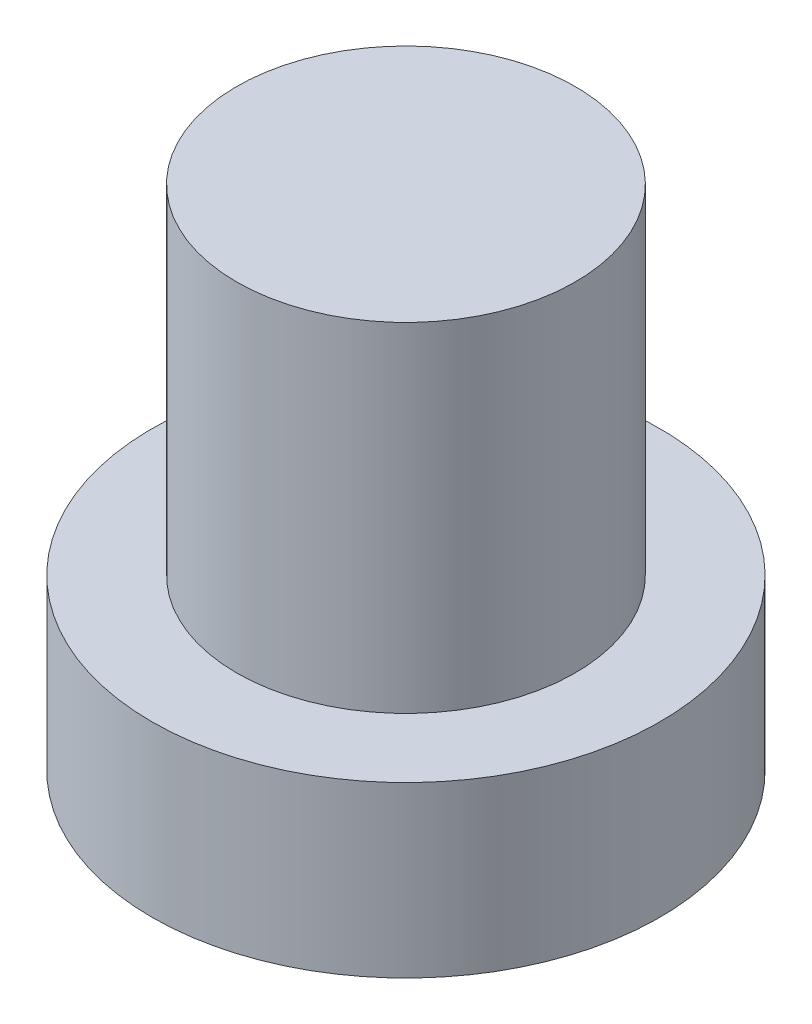
ISO-10303-21;
HEADER;
FILE_DESCRIPTION(('STEP AP214'),'2;1');
FILE_NAME('part.step','',(''),(''),'','','');
FILE_SCHEMA(('AUTOMOTIVE_DESIGN { 1 0 10303 214 1 1 1 1 }'));
ENDSEC;
DATA;
#1=APPLICATION_CONTEXT('core data for automotive mechanical design processes');
#2=APPLICATION_PROTOCOL_DEFINITION('international standard','automotive_design',2000,#1);
#3=PRODUCT_CONTEXT('',#1,'mechanical');
#4=PRODUCT('Part','Part','',(#3));
#5=PRODUCT_RELATED_PRODUCT_CATEGORY('part','',(#4));
#6=PRODUCT_DEFINITION_FORMATION('','',#4);
#7=PRODUCT_DEFINITION_CONTEXT('part definition',#1,'design');
#8=PRODUCT_DEFINITION('design','',#6,#7);
#9=PRODUCT_DEFINITION_SHAPE('','',#8);
#10=(LENGTH_UNIT() NAMED_UNIT(*) SI_UNIT(.MILLI.,.METRE.));
#11=(NAMED_UNIT(*) PLANE_ANGLE_UNIT() SI_UNIT($,.RADIAN.));
#12=(NAMED_UNIT(*) SI_UNIT($,.STERADIAN.) SOLID_ANGLE_UNIT());
#13=UNCERTAINTY_MEASURE_WITH_UNIT(LENGTH_MEASURE(1.E-05),#10,'distance_accuracy_value','');
#14=(GEOMETRIC_REPRESENTATION_CONTEXT(3) GLOBAL_UNCERTAINTY_ASSIGNED_CONTEXT((#13)) GLOBAL_UNIT_ASSIGNED_CONTEXT((#10,
#11,#12)) REPRESENTATION_CONTEXT('',''));
#15=CARTESIAN_POINT('',(0.,0.,0.));
#16=DIRECTION('',(0.,0.,1.));
#17=DIRECTION('',(1.,0.,0.));
#18=AXIS2_PLACEMENT_3D('',#15,#16,#17);
#19=CARTESIAN_POINT('',(0.,5.,0.));
#20=DIRECTION('',(0.,-1.,0.));
#21=DIRECTION('',(0.,0.,-1.));
#22=AXIS2_PLACEMENT_3D('',#19,#20,#21);
#23=CYLINDRICAL_SURFACE('',#22,7.5);
#24=CARTESIAN_POINT('',(0.,5.,0.));
#25=DIRECTION('',(0.,1.,0.));
#26=DIRECTION('',(0.,0.,1.));
#27=AXIS2_PLACEMENT_3D('',#24,#25,#26);
#28=CIRCLE('',#27,7.5);
#29=CARTESIAN_POINT('',(0.,5.,7.5));
#30=VERTEX_POINT('',#29);
#31=EDGE_CURVE('E49',#30,#30,#28,.T.);
#32=ORIENTED_EDGE('',*,*,#31,.F.);
#33=EDGE_LOOP('',(#32));
#34=FACE_BOUND('',#33,.T.);
#35=CARTESIAN_POINT('',(0.,0.,0.));
#36=DIRECTION('',(0.,1.,0.));
#37=DIRECTION('',(0.,0.,1.));
#38=AXIS2_PLACEMENT_3D('',#35,#36,#37);
#39=CIRCLE('',#38,7.5);
#40=CARTESIAN_POINT('',(0.,0.,7.5));
#41=VERTEX_POINT('',#40);
#42=EDGE_CURVE('E44',#41,#41,#39,.T.);
#43=ORIENTED_EDGE('',*,*,#42,.T.);
#44=EDGE_LOOP('',(#43));
#45=FACE_BOUND('',#44,.T.);
#46=ADVANCED_FACE('F41',(#34,#45),#23,.T.);
#47=CARTESIAN_POINT('',(0.,5.,0.));
#48=DIRECTION('',(0.,1.,0.));
#49=DIRECTION('',(0.,0.,1.));
#50=AXIS2_PLACEMENT_3D('',#47,#48,#49);
#51=PLANE('',#50);
#52=CARTESIAN_POINT('',(0.,5.,0.));
#53=DIRECTION('',(0.,1.,0.));
#54=DIRECTION('',(0.,0.,1.));
#55=AXIS2_PLACEMENT_3D('',#52,#53,#54);
#56=CIRCLE('',#55,5.);
#57=CARTESIAN_POINT('',(0.,5.,5.));
#58=VERTEX_POINT('',#57);
#59=EDGE_CURVE('E11',#58,#58,#56,.T.);
#60=ORIENTED_EDGE('',*,*,#59,.F.);
#61=EDGE_LOOP('',(#60));
#62=FACE_BOUND('',#61,.T.);
#63=ORIENTED_EDGE('',*,*,#31,.T.);
#64=EDGE_LOOP('',(#63));
#65=FACE_BOUND('',#64,.T.);
#66=ADVANCED_FACE('F132',(#62,#65),#51,.T.);
#67=CARTESIAN_POINT('',(0.,0.,0.));
#68=DIRECTION('',(0.,1.,0.));
#69=DIRECTION('',(0.,0.,1.));
#70=AXIS2_PLACEMENT_3D('',#67,#68,#69);
#71=PLANE('',#70);
#72=DIRECTION('',(-1.,0.,0.));
#73=VECTOR('',#72,1.);
#74=CARTESIAN_POINT('',(1.60700783245117,0.,5.5724484560459));
#75=LINE('',#74,#73);
#76=CARTESIAN_POINT('',(1.60700783245117,0.,5.5724484560459));
#77=VERTEX_POINT('',#76);
#78=CARTESIAN_POINT('',(-1.60700783245117,0.,5.5724484560459));
#79=VERTEX_POINT('',#78);
#80=EDGE_CURVE('E92',#77,#79,#75,.T.);
#81=ORIENTED_EDGE('',*,*,#80,.F.);
#82=DIRECTION('',(0.,0.,1.));
#83=VECTOR('',#82,1.);
#84=CARTESIAN_POINT('',(1.60700783245117,0.,-5.5724484560459));
#85=LINE('',#84,#83);
#86=CARTESIAN_POINT('',(1.60700783245117,0.,-5.5724484560459));
#87=VERTEX_POINT('',#86);
#88=EDGE_CURVE('E57',#87,#77,#85,.T.);
#89=ORIENTED_EDGE('',*,*,#88,.F.);
#90=DIRECTION('',(1.,0.,0.));
#91=VECTOR('',#90,1.);
#92=CARTESIAN_POINT('',(1.60700783245117,0.,-5.5724484560459));
#93=LINE('',#92,#91);
#94=CARTESIAN_POINT('',(-1.60700783245117,0.,-5.5724484560459));
#95=VERTEX_POINT('',#94);
#96=EDGE_CURVE('E108',#95,#87,#93,.T.);
#97=ORIENTED_EDGE('',*,*,#96,.F.);
#98=DIRECTION('',(0.,0.,-1.));
#99=VECTOR('',#98,1.);
#100=CARTESIAN_POINT('',(-1.60700783245117,0.,-5.5724484560459));
#101=LINE('',#100,#99);
#102=EDGE_CURVE('E114',#79,#95,#101,.T.);
#103=ORIENTED_EDGE('',*,*,#102,.F.);
#104=EDGE_LOOP('',(#81,#89,#97,#103));
#105=FACE_BOUND('',#104,.T.);
#106=ORIENTED_EDGE('',*,*,#42,.F.);
#107=EDGE_LOOP('',(#106));
#108=FACE_BOUND('',#107,.T.);
#109=ADVANCED_FACE('F129',(#105,#108),#71,.F.);
#110=CARTESIAN_POINT('',(0.,15.,0.));
#111=DIRECTION('',(0.,-1.,0.));
#112=DIRECTION('',(0.,0.,-1.));
#113=AXIS2_PLACEMENT_3D('',#110,#111,#112);
#114=CYLINDRICAL_SURFACE('',#113,5.);
#115=CARTESIAN_POINT('',(0.,15.,0.));
#116=DIRECTION('',(0.,1.,0.));
#117=DIRECTION('',(0.,0.,1.));
#118=AXIS2_PLACEMENT_3D('',#115,#116,#117);
#119=CIRCLE('',#118,5.);
#120=CARTESIAN_POINT('',(0.,15.,5.));
#121=VERTEX_POINT('',#120);
#122=EDGE_CURVE('E118',#121,#121,#119,.T.);
#123=ORIENTED_EDGE('',*,*,#122,.F.);
#124=EDGE_LOOP('',(#123));
#125=FACE_BOUND('',#124,.T.);
#126=ORIENTED_EDGE('',*,*,#59,.T.);
#127=EDGE_LOOP('',(#126));
#128=FACE_BOUND('',#127,.T.);
#129=ADVANCED_FACE('F131',(#125,#128),#114,.T.);
#130=CARTESIAN_POINT('',(0.,15.,0.));
#131=DIRECTION('',(0.,1.,0.));
#132=DIRECTION('',(0.,0.,1.));
#133=AXIS2_PLACEMENT_3D('',#130,#131,#132);
#134=PLANE('',#133);
#135=ORIENTED_EDGE('',*,*,#122,.T.);
#136=EDGE_LOOP('',(#135));
#137=FACE_BOUND('',#136,.T.);
#138=ADVANCED_FACE('F138',(#137),#134,.T.);
#139=CARTESIAN_POINT('',(1.60700783245117,3.,-5.5724484560459));
#140=DIRECTION('',(1.,0.,0.));
#141=DIRECTION('',(0.,0.,-1.));
#142=AXIS2_PLACEMENT_3D('',#139,#140,#141);
#143=PLANE('',#142);
#144=ORIENTED_EDGE('',*,*,#88,.T.);
#145=DIRECTION('',(0.,-1.,0.));
#146=VECTOR('',#145,1.);
#147=CARTESIAN_POINT('',(1.60700783245117,3.,5.5724484560459));
#148=LINE('',#147,#146);
#149=CARTESIAN_POINT('',(1.60700783245117,3.,5.5724484560459));
#150=VERTEX_POINT('',#149);
#151=EDGE_CURVE('E80',#150,#77,#148,.T.);
#152=ORIENTED_EDGE('',*,*,#151,.F.);
#153=DIRECTION('',(0.,0.,1.));
#154=VECTOR('',#153,1.);
#155=CARTESIAN_POINT('',(1.60700783245117,3.,-5.5724484560459));
#156=LINE('',#155,#154);
#157=CARTESIAN_POINT('',(1.60700783245117,3.,-5.5724484560459));
#158=VERTEX_POINT('',#157);
#159=EDGE_CURVE('E106',#158,#150,#156,.T.);
#160=ORIENTED_EDGE('',*,*,#159,.F.);
#161=DIRECTION('',(0.,-1.,0.));
#162=VECTOR('',#161,1.);
#163=CARTESIAN_POINT('',(1.60700783245117,3.,-5.5724484560459));
#164=LINE('',#163,#162);
#165=EDGE_CURVE('E65',#158,#87,#164,.T.);
#166=ORIENTED_EDGE('',*,*,#165,.T.);
#167=EDGE_LOOP('',(#144,#152,#160,#166));
#168=FACE_BOUND('',#167,.T.);
#169=ADVANCED_FACE('F169',(#168),#143,.F.);
#170=CARTESIAN_POINT('',(1.60700783245117,3.,-5.5724484560459));
#171=DIRECTION('',(0.,0.,-1.));
#172=DIRECTION('',(-1.,0.,0.));
#173=AXIS2_PLACEMENT_3D('',#170,#171,#172);
#174=PLANE('',#173);
#175=ORIENTED_EDGE('',*,*,#96,.T.);
#176=ORIENTED_EDGE('',*,*,#165,.F.);
#177=DIRECTION('',(1.,0.,0.));
#178=VECTOR('',#177,1.);
#179=CARTESIAN_POINT('',(1.60700783245117,3.,-5.5724484560459));
#180=LINE('',#179,#178);
#181=CARTESIAN_POINT('',(-1.60700783245117,3.,-5.5724484560459));
#182=VERTEX_POINT('',#181);
#183=EDGE_CURVE('E103',#182,#158,#180,.T.);
#184=ORIENTED_EDGE('',*,*,#183,.F.);
#185=DIRECTION('',(0.,-1.,0.));
#186=VECTOR('',#185,1.);
#187=CARTESIAN_POINT('',(-1.60700783245117,3.,-5.5724484560459));
#188=LINE('',#187,#186);
#189=EDGE_CURVE('E96',#182,#95,#188,.T.);
#190=ORIENTED_EDGE('',*,*,#189,.T.);
#191=EDGE_LOOP('',(#175,#176,#184,#190));
#192=FACE_BOUND('',#191,.T.);
#193=ADVANCED_FACE('F185',(#192),#174,.F.);
#194=CARTESIAN_POINT('',(-1.60700783245117,3.,-5.5724484560459));
#195=DIRECTION('',(-1.,0.,0.));
#196=DIRECTION('',(0.,0.,1.));
#197=AXIS2_PLACEMENT_3D('',#194,#195,#196);
#198=PLANE('',#197);
#199=ORIENTED_EDGE('',*,*,#102,.T.);
#200=ORIENTED_EDGE('',*,*,#189,.F.);
#201=DIRECTION('',(0.,0.,-1.));
#202=VECTOR('',#201,1.);
#203=CARTESIAN_POINT('',(-1.60700783245117,3.,-5.5724484560459));
#204=LINE('',#203,#202);
#205=CARTESIAN_POINT('',(-1.60700783245117,3.,5.5724484560459));
#206=VERTEX_POINT('',#205);
#207=EDGE_CURVE('E99',#206,#182,#204,.T.);
#208=ORIENTED_EDGE('',*,*,#207,.F.);
#209=DIRECTION('',(0.,-1.,0.));
#210=VECTOR('',#209,1.);
#211=CARTESIAN_POINT('',(-1.60700783245117,3.,5.5724484560459));
#212=LINE('',#211,#210);
#213=EDGE_CURVE('E85',#206,#79,#212,.T.);
#214=ORIENTED_EDGE('',*,*,#213,.T.);
#215=EDGE_LOOP('',(#199,#200,#208,#214));
#216=FACE_BOUND('',#215,.T.);
#217=ADVANCED_FACE('F100',(#216),#198,.F.);
#218=CARTESIAN_POINT('',(1.60700783245117,3.,5.5724484560459));
#219=DIRECTION('',(0.,0.,1.));
#220=DIRECTION('',(1.,0.,0.));
#221=AXIS2_PLACEMENT_3D('',#218,#219,#220);
#222=PLANE('',#221);
#223=ORIENTED_EDGE('',*,*,#80,.T.);
#224=ORIENTED_EDGE('',*,*,#213,.F.);
#225=DIRECTION('',(-1.,0.,0.));
#226=VECTOR('',#225,1.);
#227=CARTESIAN_POINT('',(1.60700783245117,3.,5.5724484560459));
#228=LINE('',#227,#226);
#229=EDGE_CURVE('E89',#150,#206,#228,.T.);
#230=ORIENTED_EDGE('',*,*,#229,.F.);
#231=ORIENTED_EDGE('',*,*,#151,.T.);
#232=EDGE_LOOP('',(#223,#224,#230,#231));
#233=FACE_BOUND('',#232,.T.);
#234=ADVANCED_FACE('F87',(#233),#222,.F.);
#235=CARTESIAN_POINT('',(0.,3.,0.));
#236=DIRECTION('',(0.,-1.,0.));
#237=DIRECTION('',(0.,0.,-1.));
#238=AXIS2_PLACEMENT_3D('',#235,#236,#237);
#239=PLANE('',#238);
#240=ORIENTED_EDGE('',*,*,#159,.T.);
#241=ORIENTED_EDGE('',*,*,#229,.T.);
#242=ORIENTED_EDGE('',*,*,#207,.T.);
#243=ORIENTED_EDGE('',*,*,#183,.T.);
#244=EDGE_LOOP('',(#240,#241,#242,#243));
#245=FACE_BOUND('',#244,.T.);
#246=ADVANCED_FACE('F105',(#245),#239,.T.);
#247=CLOSED_SHELL('',(#46,#66,#109,#129,#138,#169,#193,#217,#234,#246));
#248=MANIFOLD_SOLID_BREP('B2',#247);
#249=ADVANCED_BREP_SHAPE_REPRESENTATION('',(#18,#248),#14);
#250=SHAPE_DEFINITION_REPRESENTATION(#9,#249);
ENDSEC;
END-ISO-10303-21;
